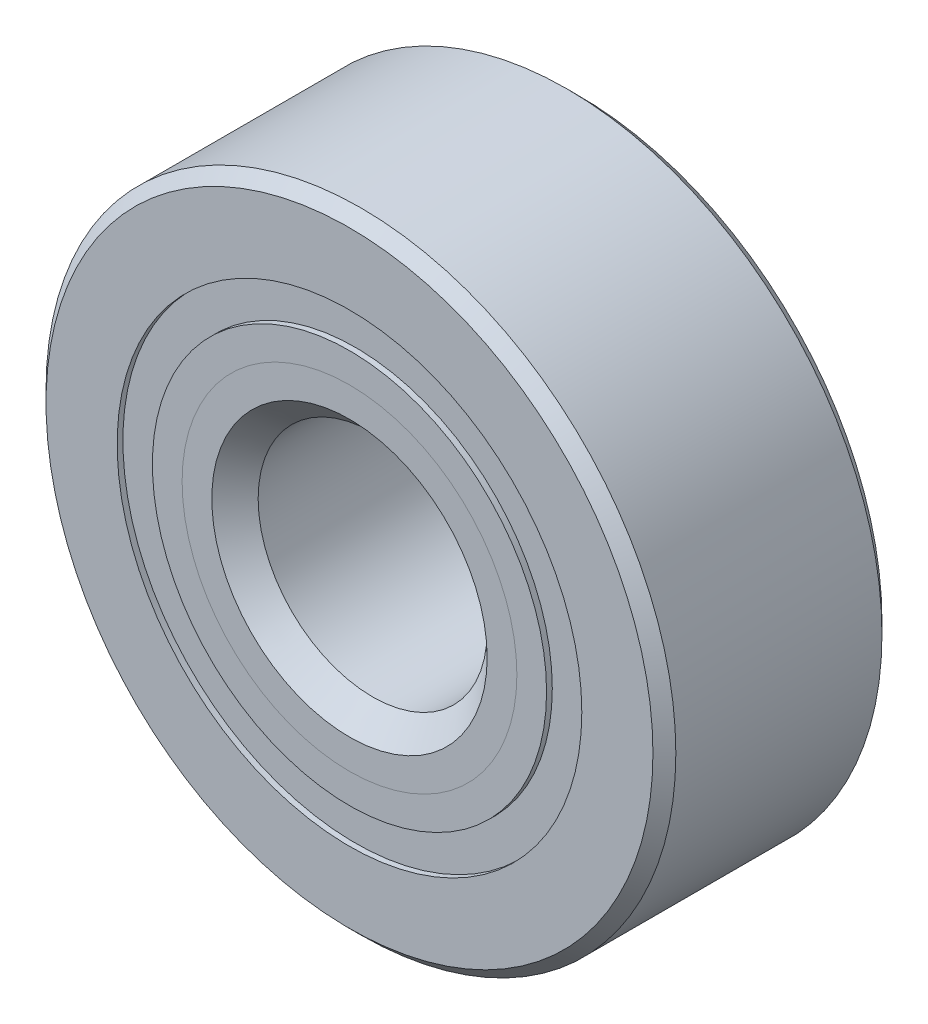
ISO-10303-21;
HEADER;
FILE_DESCRIPTION(('STEP AP214'),'2;1');
FILE_NAME('part.step','',(''),(''),'','','');
FILE_SCHEMA(('AUTOMOTIVE_DESIGN { 1 0 10303 214 1 1 1 1 }'));
ENDSEC;
DATA;
#1=APPLICATION_CONTEXT('core data for automotive mechanical design processes');
#2=APPLICATION_PROTOCOL_DEFINITION('international standard','automotive_design',2000,#1);
#3=PRODUCT_CONTEXT('',#1,'mechanical');
#4=PRODUCT('Part','Part','',(#3));
#5=PRODUCT_RELATED_PRODUCT_CATEGORY('part','',(#4));
#6=PRODUCT_DEFINITION_FORMATION('','',#4);
#7=PRODUCT_DEFINITION_CONTEXT('part definition',#1,'design');
#8=PRODUCT_DEFINITION('design','',#6,#7);
#9=PRODUCT_DEFINITION_SHAPE('','',#8);
#10=(LENGTH_UNIT() NAMED_UNIT(*) SI_UNIT(.MILLI.,.METRE.));
#11=(NAMED_UNIT(*) PLANE_ANGLE_UNIT() SI_UNIT($,.RADIAN.));
#12=(NAMED_UNIT(*) SI_UNIT($,.STERADIAN.) SOLID_ANGLE_UNIT());
#13=UNCERTAINTY_MEASURE_WITH_UNIT(LENGTH_MEASURE(1.E-05),#10,'distance_accuracy_value','');
#14=(GEOMETRIC_REPRESENTATION_CONTEXT(3) GLOBAL_UNCERTAINTY_ASSIGNED_CONTEXT((#13)) GLOBAL_UNIT_ASSIGNED_CONTEXT((#10,
#11,#12)) REPRESENTATION_CONTEXT('',''));
#15=CARTESIAN_POINT('',(0.,0.,0.));
#16=DIRECTION('',(0.,0.,1.));
#17=DIRECTION('',(1.,0.,0.));
#18=AXIS2_PLACEMENT_3D('',#15,#16,#17);
#19=CARTESIAN_POINT('',(0.,6.44158653846153,-3.01625));
#20=DIRECTION('',(0.,0.,1.));
#21=DIRECTION('',(1.,0.,0.));
#22=AXIS2_PLACEMENT_3D('',#19,#20,#21);
#23=PLANE('',#22);
#24=CARTESIAN_POINT('',(0.,0.,-3.01625));
#25=DIRECTION('',(0.,0.,1.));
#26=DIRECTION('',(1.,0.,0.));
#27=AXIS2_PLACEMENT_3D('',#24,#25,#26);
#28=CIRCLE('',#27,6.44158653846153);
#29=CARTESIAN_POINT('',(6.44158653846153,0.,-3.01625));
#30=VERTEX_POINT('',#29);
#31=EDGE_CURVE('E64',#30,#30,#28,.T.);
#32=ORIENTED_EDGE('',*,*,#31,.F.);
#33=EDGE_LOOP('',(#32));
#34=FACE_BOUND('',#33,.T.);
#35=CARTESIAN_POINT('',(0.,0.,-3.01625));
#36=DIRECTION('',(0.,0.,1.));
#37=DIRECTION('',(1.,0.,0.));
#38=AXIS2_PLACEMENT_3D('',#35,#36,#37);
#39=CIRCLE('',#38,5.46466346153847);
#40=CARTESIAN_POINT('',(5.46466346153847,0.,-3.01625));
#41=VERTEX_POINT('',#40);
#42=EDGE_CURVE('E11',#41,#41,#39,.T.);
#43=ORIENTED_EDGE('',*,*,#42,.T.);
#44=EDGE_LOOP('',(#43));
#45=FACE_BOUND('',#44,.T.);
#46=ADVANCED_FACE('F50',(#34,#45),#23,.F.);
#47=CARTESIAN_POINT('',(0.,0.,3.175));
#48=DIRECTION('',(0.,0.,1.));
#49=DIRECTION('',(1.,0.,0.));
#50=AXIS2_PLACEMENT_3D('',#47,#48,#49);
#51=CYLINDRICAL_SURFACE('',#50,5.46466346153847);
#52=ORIENTED_EDGE('',*,*,#42,.F.);
#53=EDGE_LOOP('',(#52));
#54=FACE_BOUND('',#53,.T.);
#55=CARTESIAN_POINT('',(0.,0.,-1.4932612773582));
#56=DIRECTION('',(0.,0.,1.));
#57=DIRECTION('',(1.,0.,0.));
#58=AXIS2_PLACEMENT_3D('',#55,#56,#57);
#59=CIRCLE('',#58,5.46466346153847);
#60=CARTESIAN_POINT('',(5.46466346153847,0.,-1.4932612773582));
#61=VERTEX_POINT('',#60);
#62=EDGE_CURVE('E56',#61,#61,#59,.T.);
#63=ORIENTED_EDGE('',*,*,#62,.T.);
#64=EDGE_LOOP('',(#63));
#65=FACE_BOUND('',#64,.T.);
#66=ADVANCED_FACE('F73',(#54,#65),#51,.F.);
#67=CARTESIAN_POINT('',(0.,6.44158653846153,-1.4932612773582));
#68=DIRECTION('',(0.,0.,-1.));
#69=DIRECTION('',(-1.,0.,0.));
#70=AXIS2_PLACEMENT_3D('',#67,#68,#69);
#71=PLANE('',#70);
#72=ORIENTED_EDGE('',*,*,#62,.F.);
#73=EDGE_LOOP('',(#72));
#74=FACE_BOUND('',#73,.T.);
#75=CARTESIAN_POINT('',(0.,0.,-1.4932612773582));
#76=DIRECTION('',(0.,0.,1.));
#77=DIRECTION('',(1.,0.,0.));
#78=AXIS2_PLACEMENT_3D('',#75,#76,#77);
#79=CIRCLE('',#78,6.44158653846153);
#80=CARTESIAN_POINT('',(6.44158653846153,0.,-1.4932612773582));
#81=VERTEX_POINT('',#80);
#82=EDGE_CURVE('E60',#81,#81,#79,.T.);
#83=ORIENTED_EDGE('',*,*,#82,.T.);
#84=EDGE_LOOP('',(#83));
#85=FACE_BOUND('',#84,.T.);
#86=ADVANCED_FACE('F77',(#74,#85),#71,.F.);
#87=CARTESIAN_POINT('',(0.,0.,3.175));
#88=DIRECTION('',(0.,0.,1.));
#89=DIRECTION('',(1.,0.,0.));
#90=AXIS2_PLACEMENT_3D('',#87,#88,#89);
#91=CYLINDRICAL_SURFACE('',#90,6.44158653846153);
#92=ORIENTED_EDGE('',*,*,#82,.F.);
#93=EDGE_LOOP('',(#92));
#94=FACE_BOUND('',#93,.T.);
#95=ORIENTED_EDGE('',*,*,#31,.T.);
#96=EDGE_LOOP('',(#95));
#97=FACE_BOUND('',#96,.T.);
#98=ADVANCED_FACE('F70',(#94,#97),#91,.T.);
#99=CLOSED_SHELL('',(#46,#66,#86,#98));
#100=MANIFOLD_SOLID_BREP('B2',#99);
#101=CARTESIAN_POINT('',(0.,6.44158653846153,3.01625));
#102=DIRECTION('',(0.,0.,-1.));
#103=DIRECTION('',(-1.,0.,0.));
#104=AXIS2_PLACEMENT_3D('',#101,#102,#103);
#105=PLANE('',#104);
#106=CARTESIAN_POINT('',(0.,0.,3.01625));
#107=DIRECTION('',(0.,0.,1.));
#108=DIRECTION('',(1.,0.,0.));
#109=AXIS2_PLACEMENT_3D('',#106,#107,#108);
#110=CIRCLE('',#109,5.46466346153847);
#111=CARTESIAN_POINT('',(5.46466346153847,0.,3.01625));
#112=VERTEX_POINT('',#111);
#113=EDGE_CURVE('E49',#112,#112,#110,.T.);
#114=ORIENTED_EDGE('',*,*,#113,.F.);
#115=EDGE_LOOP('',(#114));
#116=FACE_BOUND('',#115,.T.);
#117=CARTESIAN_POINT('',(0.,0.,3.01625));
#118=DIRECTION('',(0.,0.,1.));
#119=DIRECTION('',(1.,0.,0.));
#120=AXIS2_PLACEMENT_3D('',#117,#118,#119);
#121=CIRCLE('',#120,6.44158653846153);
#122=CARTESIAN_POINT('',(6.44158653846153,0.,3.01625));
#123=VERTEX_POINT('',#122);
#124=EDGE_CURVE('E124',#123,#123,#121,.T.);
#125=ORIENTED_EDGE('',*,*,#124,.T.);
#126=EDGE_LOOP('',(#125));
#127=FACE_BOUND('',#126,.T.);
#128=ADVANCED_FACE('F110',(#116,#127),#105,.F.);
#129=CARTESIAN_POINT('',(0.,0.,3.175));
#130=DIRECTION('',(0.,0.,1.));
#131=DIRECTION('',(1.,0.,0.));
#132=AXIS2_PLACEMENT_3D('',#129,#130,#131);
#133=CYLINDRICAL_SURFACE('',#132,5.46466346153847);
#134=CARTESIAN_POINT('',(0.,0.,1.4932612773582));
#135=DIRECTION('',(0.,0.,1.));
#136=DIRECTION('',(1.,0.,0.));
#137=AXIS2_PLACEMENT_3D('',#134,#135,#136);
#138=CIRCLE('',#137,5.46466346153847);
#139=CARTESIAN_POINT('',(5.46466346153847,0.,1.4932612773582));
#140=VERTEX_POINT('',#139);
#141=EDGE_CURVE('E116',#140,#140,#138,.T.);
#142=ORIENTED_EDGE('',*,*,#141,.F.);
#143=EDGE_LOOP('',(#142));
#144=FACE_BOUND('',#143,.T.);
#145=ORIENTED_EDGE('',*,*,#113,.T.);
#146=EDGE_LOOP('',(#145));
#147=FACE_BOUND('',#146,.T.);
#148=ADVANCED_FACE('F139',(#144,#147),#133,.F.);
#149=CARTESIAN_POINT('',(0.,6.44158653846153,1.4932612773582));
#150=DIRECTION('',(0.,0.,1.));
#151=DIRECTION('',(1.,0.,0.));
#152=AXIS2_PLACEMENT_3D('',#149,#150,#151);
#153=PLANE('',#152);
#154=CARTESIAN_POINT('',(0.,0.,1.4932612773582));
#155=DIRECTION('',(0.,0.,1.));
#156=DIRECTION('',(1.,0.,0.));
#157=AXIS2_PLACEMENT_3D('',#154,#155,#156);
#158=CIRCLE('',#157,6.44158653846153);
#159=CARTESIAN_POINT('',(6.44158653846153,0.,1.4932612773582));
#160=VERTEX_POINT('',#159);
#161=EDGE_CURVE('E120',#160,#160,#158,.T.);
#162=ORIENTED_EDGE('',*,*,#161,.F.);
#163=EDGE_LOOP('',(#162));
#164=FACE_BOUND('',#163,.T.);
#165=ORIENTED_EDGE('',*,*,#141,.T.);
#166=EDGE_LOOP('',(#165));
#167=FACE_BOUND('',#166,.T.);
#168=ADVANCED_FACE('F134',(#164,#167),#153,.F.);
#169=CARTESIAN_POINT('',(0.,0.,3.175));
#170=DIRECTION('',(0.,0.,1.));
#171=DIRECTION('',(1.,0.,0.));
#172=AXIS2_PLACEMENT_3D('',#169,#170,#171);
#173=CYLINDRICAL_SURFACE('',#172,6.44158653846153);
#174=ORIENTED_EDGE('',*,*,#124,.F.);
#175=EDGE_LOOP('',(#174));
#176=FACE_BOUND('',#175,.T.);
#177=ORIENTED_EDGE('',*,*,#161,.T.);
#178=EDGE_LOOP('',(#177));
#179=FACE_BOUND('',#178,.T.);
#180=ADVANCED_FACE('F131',(#176,#179),#173,.T.);
#181=CLOSED_SHELL('',(#128,#148,#168,#180));
#182=MANIFOLD_SOLID_BREP('B6',#181);
#183=CARTESIAN_POINT('',(-4.20949505675111,4.20949505675122,0.));
#184=DIRECTION('',(0.,0.,1.));
#185=DIRECTION('',(-0.707106781186539,0.707106781186556,0.));
#186=AXIS2_PLACEMENT_3D('',#183,#184,#185);
#187=SPHERICAL_SURFACE('',#186,1.4932612773582);
#188=CARTESIAN_POINT('',(-4.20949505675111,4.20949505675122,1.4932612773582));
#189=VERTEX_POINT('',#188);
#190=VERTEX_LOOP('',#189);
#191=FACE_BOUND('',#190,.T.);
#192=ADVANCED_FACE('F170',(#191),#187,.T.);
#193=CLOSED_SHELL('',(#192));
#194=MANIFOLD_SOLID_BREP('B44',#193);
#195=CARTESIAN_POINT('',(-5.953125,0.,0.));
#196=DIRECTION('',(0.,0.,1.));
#197=DIRECTION('',(-1.,0.,0.));
#198=AXIS2_PLACEMENT_3D('',#195,#196,#197);
#199=SPHERICAL_SURFACE('',#198,1.4932612773582);
#200=CARTESIAN_POINT('',(-5.953125,0.,1.4932612773582));
#201=VERTEX_POINT('',#200);
#202=VERTEX_LOOP('',#201);
#203=FACE_BOUND('',#202,.T.);
#204=ADVANCED_FACE('F209',(#203),#199,.T.);
#205=CLOSED_SHELL('',(#204));
#206=MANIFOLD_SOLID_BREP('B106',#205);
#207=CARTESIAN_POINT('',(-4.2094950567512,-4.20949505675113,0.));
#208=DIRECTION('',(0.,0.,1.));
#209=DIRECTION('',(-0.707106781186554,-0.707106781186541,0.));
#210=AXIS2_PLACEMENT_3D('',#207,#208,#209);
#211=SPHERICAL_SURFACE('',#210,1.4932612773582);
#212=CARTESIAN_POINT('',(-4.2094950567512,-4.20949505675113,1.4932612773582));
#213=VERTEX_POINT('',#212);
#214=VERTEX_LOOP('',#213);
#215=FACE_BOUND('',#214,.T.);
#216=ADVANCED_FACE('F248',(#215),#211,.T.);
#217=CLOSED_SHELL('',(#216));
#218=MANIFOLD_SOLID_BREP('B166',#217);
#219=CARTESIAN_POINT('',(0.,-5.953125,0.));
#220=DIRECTION('',(0.,0.,1.));
#221=DIRECTION('',(0.,-1.,0.));
#222=AXIS2_PLACEMENT_3D('',#219,#220,#221);
#223=SPHERICAL_SURFACE('',#222,1.4932612773582);
#224=CARTESIAN_POINT('',(0.,-5.953125,1.4932612773582));
#225=VERTEX_POINT('',#224);
#226=VERTEX_LOOP('',#225);
#227=FACE_BOUND('',#226,.T.);
#228=ADVANCED_FACE('F287',(#227),#223,.T.);
#229=CLOSED_SHELL('',(#228));
#230=MANIFOLD_SOLID_BREP('B205',#229);
#231=CARTESIAN_POINT('',(4.20949505675114,-4.20949505675119,0.));
#232=DIRECTION('',(0.,0.,1.));
#233=DIRECTION('',(0.707106781186544,-0.707106781186551,0.));
#234=AXIS2_PLACEMENT_3D('',#231,#232,#233);
#235=SPHERICAL_SURFACE('',#234,1.4932612773582);
#236=CARTESIAN_POINT('',(4.20949505675114,-4.20949505675119,1.4932612773582));
#237=VERTEX_POINT('',#236);
#238=VERTEX_LOOP('',#237);
#239=FACE_BOUND('',#238,.T.);
#240=ADVANCED_FACE('F326',(#239),#235,.T.);
#241=CLOSED_SHELL('',(#240));
#242=MANIFOLD_SOLID_BREP('B244',#241);
#243=CARTESIAN_POINT('',(5.953125,0.,0.));
#244=DIRECTION('',(0.,0.,1.));
#245=DIRECTION('',(1.,0.,0.));
#246=AXIS2_PLACEMENT_3D('',#243,#244,#245);
#247=SPHERICAL_SURFACE('',#246,1.4932612773582);
#248=CARTESIAN_POINT('',(5.953125,0.,1.4932612773582));
#249=VERTEX_POINT('',#248);
#250=VERTEX_LOOP('',#249);
#251=FACE_BOUND('',#250,.T.);
#252=ADVANCED_FACE('F365',(#251),#247,.T.);
#253=CLOSED_SHELL('',(#252));
#254=MANIFOLD_SOLID_BREP('B283',#253);
#255=CARTESIAN_POINT('',(4.20949505675117,4.20949505675116,0.));
#256=DIRECTION('',(0.,0.,1.));
#257=DIRECTION('',(0.707106781186549,0.707106781186546,0.));
#258=AXIS2_PLACEMENT_3D('',#255,#256,#257);
#259=SPHERICAL_SURFACE('',#258,1.4932612773582);
#260=CARTESIAN_POINT('',(4.20949505675117,4.20949505675116,1.4932612773582));
#261=VERTEX_POINT('',#260);
#262=VERTEX_LOOP('',#261);
#263=FACE_BOUND('',#262,.T.);
#264=ADVANCED_FACE('F404',(#263),#259,.T.);
#265=CLOSED_SHELL('',(#264));
#266=MANIFOLD_SOLID_BREP('B322',#265);
#267=CARTESIAN_POINT('',(0.,5.953125,0.));
#268=DIRECTION('',(0.,0.,1.));
#269=DIRECTION('',(0.,1.,0.));
#270=AXIS2_PLACEMENT_3D('',#267,#268,#269);
#271=SPHERICAL_SURFACE('',#270,1.4932612773582);
#272=CARTESIAN_POINT('',(0.,5.953125,1.4932612773582));
#273=VERTEX_POINT('',#272);
#274=VERTEX_LOOP('',#273);
#275=FACE_BOUND('',#274,.T.);
#276=ADVANCED_FACE('F445',(#275),#271,.T.);
#277=CLOSED_SHELL('',(#276));
#278=MANIFOLD_SOLID_BREP('B361',#277);
#279=CARTESIAN_POINT('',(0.,4.64104766142968,3.175));
#280=DIRECTION('',(0.,0.,-1.));
#281=DIRECTION('',(-1.,0.,0.));
#282=AXIS2_PLACEMENT_3D('',#279,#280,#281);
#283=PLANE('',#282);
#284=CARTESIAN_POINT('',(0.,0.,3.175));
#285=DIRECTION('',(0.,0.,1.));
#286=DIRECTION('',(1.,0.,0.));
#287=AXIS2_PLACEMENT_3D('',#284,#285,#286);
#288=CIRCLE('',#287,3.8174318613209);
#289=CARTESIAN_POINT('',(3.8174318613209,0.,3.175));
#290=VERTEX_POINT('',#289);
#291=EDGE_CURVE('E498',#290,#290,#288,.T.);
#292=ORIENTED_EDGE('',*,*,#291,.F.);
#293=EDGE_LOOP('',(#292));
#294=FACE_BOUND('',#293,.T.);
#295=CARTESIAN_POINT('',(0.,0.,3.175));
#296=DIRECTION('',(0.,0.,1.));
#297=DIRECTION('',(1.,0.,0.));
#298=AXIS2_PLACEMENT_3D('',#295,#296,#297);
#299=CIRCLE('',#298,4.64104766142968);
#300=CARTESIAN_POINT('',(4.64104766142968,0.,3.175));
#301=VERTEX_POINT('',#300);
#302=EDGE_CURVE('E444',#301,#301,#299,.T.);
#303=ORIENTED_EDGE('',*,*,#302,.T.);
#304=EDGE_LOOP('',(#303));
#305=FACE_BOUND('',#304,.T.);
#306=ADVANCED_FACE('F464',(#294,#305),#283,.F.);
#307=CARTESIAN_POINT('',(0.,0.,2.35138419989122));
#308=DIRECTION('',(0.,0.,1.));
#309=DIRECTION('',(1.,0.,0.));
#310=AXIS2_PLACEMENT_3D('',#307,#308,#309);
#311=CONICAL_SURFACE('',#310,3.8174318613209,0.785398163397449);
#312=ORIENTED_EDGE('',*,*,#302,.F.);
#313=EDGE_LOOP('',(#312));
#314=FACE_BOUND('',#313,.T.);
#315=CARTESIAN_POINT('',(0.,0.,2.35138419989122));
#316=DIRECTION('',(0.,0.,1.));
#317=DIRECTION('',(1.,0.,0.));
#318=AXIS2_PLACEMENT_3D('',#315,#316,#317);
#319=CIRCLE('',#318,3.8174318613209);
#320=CARTESIAN_POINT('',(3.8174318613209,0.,2.35138419989122));
#321=VERTEX_POINT('',#320);
#322=EDGE_CURVE('E470',#321,#321,#319,.T.);
#323=ORIENTED_EDGE('',*,*,#322,.T.);
#324=EDGE_LOOP('',(#323));
#325=FACE_BOUND('',#324,.T.);
#326=ADVANCED_FACE('F505',(#314,#325),#311,.T.);
#327=CARTESIAN_POINT('',(0.,0.,3.175));
#328=DIRECTION('',(0.,0.,1.));
#329=DIRECTION('',(1.,0.,0.));
#330=AXIS2_PLACEMENT_3D('',#327,#328,#329);
#331=CYLINDRICAL_SURFACE('',#330,3.8174318613209);
#332=ORIENTED_EDGE('',*,*,#322,.F.);
#333=EDGE_LOOP('',(#332));
#334=FACE_BOUND('',#333,.T.);
#335=CARTESIAN_POINT('',(0.,0.,0.));
#336=DIRECTION('',(0.,0.,1.));
#337=DIRECTION('',(1.,0.,0.));
#338=AXIS2_PLACEMENT_3D('',#335,#336,#337);
#339=CIRCLE('',#338,3.8174318613209);
#340=CARTESIAN_POINT('',(3.8174318613209,0.,0.));
#341=VERTEX_POINT('',#340);
#342=EDGE_CURVE('E474',#341,#341,#339,.T.);
#343=ORIENTED_EDGE('',*,*,#342,.T.);
#344=EDGE_LOOP('',(#343));
#345=FACE_BOUND('',#344,.T.);
#346=ADVANCED_FACE('F509',(#334,#345),#331,.T.);
#347=CARTESIAN_POINT('',(0.,3.8174318613209,0.));
#348=DIRECTION('',(0.,0.,-1.));
#349=DIRECTION('',(-1.,0.,0.));
#350=AXIS2_PLACEMENT_3D('',#347,#348,#349);
#351=PLANE('',#350);
#352=ORIENTED_EDGE('',*,*,#342,.F.);
#353=EDGE_LOOP('',(#352));
#354=FACE_BOUND('',#353,.T.);
#355=CARTESIAN_POINT('',(0.,0.,0.));
#356=DIRECTION('',(0.,0.,1.));
#357=DIRECTION('',(1.,0.,0.));
#358=AXIS2_PLACEMENT_3D('',#355,#356,#357);
#359=CIRCLE('',#358,4.4598637226418);
#360=CARTESIAN_POINT('',(4.4598637226418,0.,0.));
#361=VERTEX_POINT('',#360);
#362=EDGE_CURVE('E478',#361,#361,#359,.T.);
#363=ORIENTED_EDGE('',*,*,#362,.T.);
#364=EDGE_LOOP('',(#363));
#365=FACE_BOUND('',#364,.T.);
#366=ADVANCED_FACE('F514',(#354,#365),#351,.F.);
#367=CARTESIAN_POINT('',(0.,0.,0.));
#368=DIRECTION('',(0.,0.,1.));
#369=DIRECTION('',(1.,0.,0.));
#370=AXIS2_PLACEMENT_3D('',#367,#368,#369);
#371=TOROIDAL_SURFACE('',#370,5.953125,1.4932612773582);
#372=ORIENTED_EDGE('',*,*,#362,.F.);
#373=EDGE_LOOP('',(#372));
#374=FACE_BOUND('',#373,.T.);
#375=CARTESIAN_POINT('',(0.,0.,-1.41111111111111));
#376=DIRECTION('',(0.,0.,1.));
#377=DIRECTION('',(1.,0.,0.));
#378=AXIS2_PLACEMENT_3D('',#375,#376,#377);
#379=CIRCLE('',#378,5.46466346153847);
#380=CARTESIAN_POINT('',(5.46466346153847,0.,-1.41111111111111));
#381=VERTEX_POINT('',#380);
#382=EDGE_CURVE('E483',#381,#381,#379,.T.);
#383=ORIENTED_EDGE('',*,*,#382,.T.);
#384=EDGE_LOOP('',(#383));
#385=FACE_BOUND('',#384,.T.);
#386=ADVANCED_FACE('F520',(#374,#385),#371,.F.);
#387=CARTESIAN_POINT('',(0.,0.,3.175));
#388=DIRECTION('',(0.,0.,1.));
#389=DIRECTION('',(1.,0.,0.));
#390=AXIS2_PLACEMENT_3D('',#387,#388,#389);
#391=CYLINDRICAL_SURFACE('',#390,5.46466346153846);
#392=ORIENTED_EDGE('',*,*,#382,.F.);
#393=EDGE_LOOP('',(#392));
#394=FACE_BOUND('',#393,.T.);
#395=CARTESIAN_POINT('',(0.,0.,-3.175));
#396=DIRECTION('',(0.,0.,1.));
#397=DIRECTION('',(1.,0.,0.));
#398=AXIS2_PLACEMENT_3D('',#395,#396,#397);
#399=CIRCLE('',#398,5.46466346153846);
#400=CARTESIAN_POINT('',(5.46466346153846,0.,-3.175));
#401=VERTEX_POINT('',#400);
#402=EDGE_CURVE('E486',#401,#401,#399,.T.);
#403=ORIENTED_EDGE('',*,*,#402,.T.);
#404=EDGE_LOOP('',(#403));
#405=FACE_BOUND('',#404,.T.);
#406=ADVANCED_FACE('F524',(#394,#405),#391,.T.);
#407=CARTESIAN_POINT('',(0.,3.4925,-3.175));
#408=DIRECTION('',(0.,0.,1.));
#409=DIRECTION('',(1.,0.,0.));
#410=AXIS2_PLACEMENT_3D('',#407,#408,#409);
#411=PLANE('',#410);
#412=ORIENTED_EDGE('',*,*,#402,.F.);
#413=EDGE_LOOP('',(#412));
#414=FACE_BOUND('',#413,.T.);
#415=CARTESIAN_POINT('',(0.,0.,-3.17500000000001));
#416=DIRECTION('',(0.,0.,1.));
#417=DIRECTION('',(1.,0.,0.));
#418=AXIS2_PLACEMENT_3D('',#415,#416,#417);
#419=CIRCLE('',#418,3.4925);
#420=CARTESIAN_POINT('',(3.4925,0.,-3.17500000000001));
#421=VERTEX_POINT('',#420);
#422=EDGE_CURVE('E489',#421,#421,#419,.T.);
#423=ORIENTED_EDGE('',*,*,#422,.T.);
#424=EDGE_LOOP('',(#423));
#425=FACE_BOUND('',#424,.T.);
#426=ADVANCED_FACE('F528',(#414,#425),#411,.F.);
#427=CARTESIAN_POINT('',(0.,0.,-2.8575));
#428=DIRECTION('',(0.,0.,-1.));
#429=DIRECTION('',(-1.,0.,0.));
#430=AXIS2_PLACEMENT_3D('',#427,#428,#429);
#431=CONICAL_SURFACE('',#430,3.175,0.785398163397448);
#432=ORIENTED_EDGE('',*,*,#422,.F.);
#433=EDGE_LOOP('',(#432));
#434=FACE_BOUND('',#433,.T.);
#435=CARTESIAN_POINT('',(0.,0.,-2.8575));
#436=DIRECTION('',(0.,0.,1.));
#437=DIRECTION('',(1.,0.,0.));
#438=AXIS2_PLACEMENT_3D('',#435,#436,#437);
#439=CIRCLE('',#438,3.175);
#440=CARTESIAN_POINT('',(3.175,0.,-2.8575));
#441=VERTEX_POINT('',#440);
#442=EDGE_CURVE('E492',#441,#441,#439,.T.);
#443=ORIENTED_EDGE('',*,*,#442,.T.);
#444=EDGE_LOOP('',(#443));
#445=FACE_BOUND('',#444,.T.);
#446=ADVANCED_FACE('F532',(#434,#445),#431,.F.);
#447=CARTESIAN_POINT('',(0.,0.,3.175));
#448=DIRECTION('',(0.,0.,1.));
#449=DIRECTION('',(1.,0.,0.));
#450=AXIS2_PLACEMENT_3D('',#447,#448,#449);
#451=CYLINDRICAL_SURFACE('',#450,3.175);
#452=ORIENTED_EDGE('',*,*,#442,.F.);
#453=EDGE_LOOP('',(#452));
#454=FACE_BOUND('',#453,.T.);
#455=CARTESIAN_POINT('',(0.,0.,2.5325681386791));
#456=DIRECTION('',(0.,0.,1.));
#457=DIRECTION('',(1.,0.,0.));
#458=AXIS2_PLACEMENT_3D('',#455,#456,#457);
#459=CIRCLE('',#458,3.175);
#460=CARTESIAN_POINT('',(3.175,0.,2.5325681386791));
#461=VERTEX_POINT('',#460);
#462=EDGE_CURVE('E495',#461,#461,#459,.T.);
#463=ORIENTED_EDGE('',*,*,#462,.T.);
#464=EDGE_LOOP('',(#463));
#465=FACE_BOUND('',#464,.T.);
#466=ADVANCED_FACE('F536',(#454,#465),#451,.F.);
#467=CARTESIAN_POINT('',(0.,0.,3.175));
#468=DIRECTION('',(0.,0.,1.));
#469=DIRECTION('',(1.,0.,0.));
#470=AXIS2_PLACEMENT_3D('',#467,#468,#469);
#471=CONICAL_SURFACE('',#470,3.8174318613209,0.78539816339745);
#472=ORIENTED_EDGE('',*,*,#462,.F.);
#473=EDGE_LOOP('',(#472));
#474=FACE_BOUND('',#473,.T.);
#475=ORIENTED_EDGE('',*,*,#291,.T.);
#476=EDGE_LOOP('',(#475));
#477=FACE_BOUND('',#476,.T.);
#478=ADVANCED_FACE('F502',(#474,#477),#471,.F.);
#479=CLOSED_SHELL('',(#306,#326,#346,#366,#386,#406,#426,#446,#466,#478));
#480=MANIFOLD_SOLID_BREP('B400',#479);
#481=CARTESIAN_POINT('',(0.,5.46466346153847,3.175));
#482=DIRECTION('',(0.,0.,-1.));
#483=DIRECTION('',(-1.,0.,0.));
#484=AXIS2_PLACEMENT_3D('',#481,#482,#483);
#485=PLANE('',#484);
#486=CARTESIAN_POINT('',(0.,0.,3.175));
#487=DIRECTION('',(0.,0.,1.));
#488=DIRECTION('',(1.,0.,0.));
#489=AXIS2_PLACEMENT_3D('',#486,#487,#488);
#490=CIRCLE('',#489,4.64104766142968);
#491=CARTESIAN_POINT('',(4.64104766142968,0.,3.175));
#492=VERTEX_POINT('',#491);
#493=EDGE_CURVE('E463',#492,#492,#490,.T.);
#494=ORIENTED_EDGE('',*,*,#493,.F.);
#495=EDGE_LOOP('',(#494));
#496=FACE_BOUND('',#495,.T.);
#497=CARTESIAN_POINT('',(0.,0.,3.175));
#498=DIRECTION('',(0.,0.,1.));
#499=DIRECTION('',(1.,0.,0.));
#500=AXIS2_PLACEMENT_3D('',#497,#498,#499);
#501=CIRCLE('',#500,5.46466346153847);
#502=CARTESIAN_POINT('',(5.46466346153847,0.,3.175));
#503=VERTEX_POINT('',#502);
#504=EDGE_CURVE('E625',#503,#503,#501,.T.);
#505=ORIENTED_EDGE('',*,*,#504,.T.);
#506=EDGE_LOOP('',(#505));
#507=FACE_BOUND('',#506,.T.);
#508=ADVANCED_FACE('F603',(#496,#507),#485,.F.);
#509=CARTESIAN_POINT('',(0.,0.,3.175));
#510=DIRECTION('',(0.,0.,1.));
#511=DIRECTION('',(1.,0.,0.));
#512=AXIS2_PLACEMENT_3D('',#509,#510,#511);
#513=CONICAL_SURFACE('',#512,4.64104766142968,0.785398163397449);
#514=CARTESIAN_POINT('',(0.,0.,2.35138419989122));
#515=DIRECTION('',(0.,0.,1.));
#516=DIRECTION('',(1.,0.,0.));
#517=AXIS2_PLACEMENT_3D('',#514,#515,#516);
#518=CIRCLE('',#517,3.8174318613209);
#519=CARTESIAN_POINT('',(3.8174318613209,0.,2.35138419989122));
#520=VERTEX_POINT('',#519);
#521=EDGE_CURVE('E609',#520,#520,#518,.T.);
#522=ORIENTED_EDGE('',*,*,#521,.F.);
#523=EDGE_LOOP('',(#522));
#524=FACE_BOUND('',#523,.T.);
#525=ORIENTED_EDGE('',*,*,#493,.T.);
#526=EDGE_LOOP('',(#525));
#527=FACE_BOUND('',#526,.T.);
#528=ADVANCED_FACE('F650',(#524,#527),#513,.F.);
#529=CARTESIAN_POINT('',(0.,0.,3.175));
#530=DIRECTION('',(0.,0.,1.));
#531=DIRECTION('',(1.,0.,0.));
#532=AXIS2_PLACEMENT_3D('',#529,#530,#531);
#533=CYLINDRICAL_SURFACE('',#532,3.8174318613209);
#534=CARTESIAN_POINT('',(0.,0.,0.));
#535=DIRECTION('',(0.,0.,1.));
#536=DIRECTION('',(1.,0.,0.));
#537=AXIS2_PLACEMENT_3D('',#534,#535,#536);
#538=CIRCLE('',#537,3.8174318613209);
#539=CARTESIAN_POINT('',(3.8174318613209,0.,0.));
#540=VERTEX_POINT('',#539);
#541=EDGE_CURVE('E613',#540,#540,#538,.T.);
#542=ORIENTED_EDGE('',*,*,#541,.F.);
#543=EDGE_LOOP('',(#542));
#544=FACE_BOUND('',#543,.T.);
#545=ORIENTED_EDGE('',*,*,#521,.T.);
#546=EDGE_LOOP('',(#545));
#547=FACE_BOUND('',#546,.T.);
#548=ADVANCED_FACE('F645',(#544,#547),#533,.F.);
#549=CARTESIAN_POINT('',(0.,3.8174318613209,0.));
#550=DIRECTION('',(0.,0.,1.));
#551=DIRECTION('',(1.,0.,0.));
#552=AXIS2_PLACEMENT_3D('',#549,#550,#551);
#553=PLANE('',#552);
#554=CARTESIAN_POINT('',(0.,0.,0.));
#555=DIRECTION('',(0.,0.,1.));
#556=DIRECTION('',(1.,0.,0.));
#557=AXIS2_PLACEMENT_3D('',#554,#555,#556);
#558=CIRCLE('',#557,4.4598637226418);
#559=CARTESIAN_POINT('',(4.4598637226418,0.,0.));
#560=VERTEX_POINT('',#559);
#561=EDGE_CURVE('E617',#560,#560,#558,.T.);
#562=ORIENTED_EDGE('',*,*,#561,.F.);
#563=EDGE_LOOP('',(#562));
#564=FACE_BOUND('',#563,.T.);
#565=ORIENTED_EDGE('',*,*,#541,.T.);
#566=EDGE_LOOP('',(#565));
#567=FACE_BOUND('',#566,.T.);
#568=ADVANCED_FACE('F639',(#564,#567),#553,.F.);
#569=CARTESIAN_POINT('',(0.,0.,0.));
#570=DIRECTION('',(0.,0.,1.));
#571=DIRECTION('',(1.,0.,0.));
#572=AXIS2_PLACEMENT_3D('',#569,#570,#571);
#573=TOROIDAL_SURFACE('',#572,5.953125,1.4932612773582);
#574=CARTESIAN_POINT('',(0.,0.,1.41111111111111));
#575=DIRECTION('',(0.,0.,1.));
#576=DIRECTION('',(1.,0.,0.));
#577=AXIS2_PLACEMENT_3D('',#574,#575,#576);
#578=CIRCLE('',#577,5.46466346153847);
#579=CARTESIAN_POINT('',(5.46466346153847,0.,1.41111111111111));
#580=VERTEX_POINT('',#579);
#581=EDGE_CURVE('E622',#580,#580,#578,.T.);
#582=ORIENTED_EDGE('',*,*,#581,.F.);
#583=EDGE_LOOP('',(#582));
#584=FACE_BOUND('',#583,.T.);
#585=ORIENTED_EDGE('',*,*,#561,.T.);
#586=EDGE_LOOP('',(#585));
#587=FACE_BOUND('',#586,.T.);
#588=ADVANCED_FACE('F633',(#584,#587),#573,.F.);
#589=CARTESIAN_POINT('',(0.,0.,3.175));
#590=DIRECTION('',(0.,0.,1.));
#591=DIRECTION('',(1.,0.,0.));
#592=AXIS2_PLACEMENT_3D('',#589,#590,#591);
#593=CYLINDRICAL_SURFACE('',#592,5.46466346153847);
#594=ORIENTED_EDGE('',*,*,#504,.F.);
#595=EDGE_LOOP('',(#594));
#596=FACE_BOUND('',#595,.T.);
#597=ORIENTED_EDGE('',*,*,#581,.T.);
#598=EDGE_LOOP('',(#597));
#599=FACE_BOUND('',#598,.T.);
#600=ADVANCED_FACE('F630',(#596,#599),#593,.T.);
#601=CLOSED_SHELL('',(#508,#528,#548,#568,#588,#600));
#602=MANIFOLD_SOLID_BREP('B439',#601);
#603=CARTESIAN_POINT('',(0.,0.,2.8575));
#604=DIRECTION('',(0.,0.,-1.));
#605=DIRECTION('',(-1.,0.,0.));
#606=AXIS2_PLACEMENT_3D('',#603,#604,#605);
#607=CONICAL_SURFACE('',#606,8.73125,0.785398163397448);
#608=CARTESIAN_POINT('',(0.,0.,3.175));
#609=DIRECTION('',(0.,0.,1.));
#610=DIRECTION('',(1.,0.,0.));
#611=AXIS2_PLACEMENT_3D('',#608,#609,#610);
#612=CIRCLE('',#611,8.41375);
#613=CARTESIAN_POINT('',(8.41375,0.,3.175));
#614=VERTEX_POINT('',#613);
#615=EDGE_CURVE('E711',#614,#614,#612,.T.);
#616=ORIENTED_EDGE('',*,*,#615,.F.);
#617=EDGE_LOOP('',(#616));
#618=FACE_BOUND('',#617,.T.);
#619=CARTESIAN_POINT('',(0.,0.,2.8575));
#620=DIRECTION('',(0.,0.,1.));
#621=DIRECTION('',(1.,0.,0.));
#622=AXIS2_PLACEMENT_3D('',#619,#620,#621);
#623=CIRCLE('',#622,8.73125);
#624=CARTESIAN_POINT('',(8.73125,0.,2.8575));
#625=VERTEX_POINT('',#624);
#626=EDGE_CURVE('E602',#625,#625,#623,.T.);
#627=ORIENTED_EDGE('',*,*,#626,.T.);
#628=EDGE_LOOP('',(#627));
#629=FACE_BOUND('',#628,.T.);
#630=ADVANCED_FACE('F683',(#618,#629),#607,.T.);
#631=CARTESIAN_POINT('',(0.,0.,3.175));
#632=DIRECTION('',(0.,0.,1.));
#633=DIRECTION('',(1.,0.,0.));
#634=AXIS2_PLACEMENT_3D('',#631,#632,#633);
#635=CYLINDRICAL_SURFACE('',#634,8.73125);
#636=ORIENTED_EDGE('',*,*,#626,.F.);
#637=EDGE_LOOP('',(#636));
#638=FACE_BOUND('',#637,.T.);
#639=CARTESIAN_POINT('',(0.,0.,-2.8575));
#640=DIRECTION('',(0.,0.,1.));
#641=DIRECTION('',(1.,0.,0.));
#642=AXIS2_PLACEMENT_3D('',#639,#640,#641);
#643=CIRCLE('',#642,8.73125);
#644=CARTESIAN_POINT('',(8.73125,0.,-2.8575));
#645=VERTEX_POINT('',#644);
#646=EDGE_CURVE('E689',#645,#645,#643,.T.);
#647=ORIENTED_EDGE('',*,*,#646,.T.);
#648=EDGE_LOOP('',(#647));
#649=FACE_BOUND('',#648,.T.);
#650=ADVANCED_FACE('F718',(#638,#649),#635,.T.);
#651=CARTESIAN_POINT('',(0.,0.,-3.175));
#652=DIRECTION('',(0.,0.,1.));
#653=DIRECTION('',(1.,0.,0.));
#654=AXIS2_PLACEMENT_3D('',#651,#652,#653);
#655=CONICAL_SURFACE('',#654,8.41375,0.785398163397448);
#656=ORIENTED_EDGE('',*,*,#646,.F.);
#657=EDGE_LOOP('',(#656));
#658=FACE_BOUND('',#657,.T.);
#659=CARTESIAN_POINT('',(0.,0.,-3.175));
#660=DIRECTION('',(0.,0.,1.));
#661=DIRECTION('',(1.,0.,0.));
#662=AXIS2_PLACEMENT_3D('',#659,#660,#661);
#663=CIRCLE('',#662,8.41375);
#664=CARTESIAN_POINT('',(8.41375,0.,-3.175));
#665=VERTEX_POINT('',#664);
#666=EDGE_CURVE('E693',#665,#665,#663,.T.);
#667=ORIENTED_EDGE('',*,*,#666,.T.);
#668=EDGE_LOOP('',(#667));
#669=FACE_BOUND('',#668,.T.);
#670=ADVANCED_FACE('F722',(#658,#669),#655,.T.);
#671=CARTESIAN_POINT('',(0.,8.41375,-3.175));
#672=DIRECTION('',(0.,0.,1.));
#673=DIRECTION('',(1.,0.,0.));
#674=AXIS2_PLACEMENT_3D('',#671,#672,#673);
#675=PLANE('',#674);
#676=ORIENTED_EDGE('',*,*,#666,.F.);
#677=EDGE_LOOP('',(#676));
#678=FACE_BOUND('',#677,.T.);
#679=CARTESIAN_POINT('',(0.,0.,-3.175));
#680=DIRECTION('',(0.,0.,1.));
#681=DIRECTION('',(1.,0.,0.));
#682=AXIS2_PLACEMENT_3D('',#679,#680,#681);
#683=CIRCLE('',#682,6.44158653846153);
#684=CARTESIAN_POINT('',(6.44158653846153,0.,-3.175));
#685=VERTEX_POINT('',#684);
#686=EDGE_CURVE('E697',#685,#685,#683,.T.);
#687=ORIENTED_EDGE('',*,*,#686,.T.);
#688=EDGE_LOOP('',(#687));
#689=FACE_BOUND('',#688,.T.);
#690=ADVANCED_FACE('F727',(#678,#689),#675,.F.);
#691=CARTESIAN_POINT('',(0.,0.,3.175));
#692=DIRECTION('',(0.,0.,1.));
#693=DIRECTION('',(1.,0.,0.));
#694=AXIS2_PLACEMENT_3D('',#691,#692,#693);
#695=CYLINDRICAL_SURFACE('',#694,6.44158653846153);
#696=ORIENTED_EDGE('',*,*,#686,.F.);
#697=EDGE_LOOP('',(#696));
#698=FACE_BOUND('',#697,.T.);
#699=CARTESIAN_POINT('',(0.,0.,-1.41111111111111));
#700=DIRECTION('',(0.,0.,1.));
#701=DIRECTION('',(1.,0.,0.));
#702=AXIS2_PLACEMENT_3D('',#699,#700,#701);
#703=CIRCLE('',#702,6.44158653846153);
#704=CARTESIAN_POINT('',(6.44158653846153,0.,-1.41111111111111));
#705=VERTEX_POINT('',#704);
#706=EDGE_CURVE('E702',#705,#705,#703,.T.);
#707=ORIENTED_EDGE('',*,*,#706,.T.);
#708=EDGE_LOOP('',(#707));
#709=FACE_BOUND('',#708,.T.);
#710=ADVANCED_FACE('F733',(#698,#709),#695,.F.);
#711=CARTESIAN_POINT('',(0.,0.,0.));
#712=DIRECTION('',(0.,0.,1.));
#713=DIRECTION('',(1.,0.,0.));
#714=AXIS2_PLACEMENT_3D('',#711,#712,#713);
#715=TOROIDAL_SURFACE('',#714,5.953125,1.4932612773582);
#716=ORIENTED_EDGE('',*,*,#706,.F.);
#717=EDGE_LOOP('',(#716));
#718=FACE_BOUND('',#717,.T.);
#719=CARTESIAN_POINT('',(0.,0.,1.41111111111111));
#720=DIRECTION('',(0.,0.,1.));
#721=DIRECTION('',(1.,0.,0.));
#722=AXIS2_PLACEMENT_3D('',#719,#720,#721);
#723=CIRCLE('',#722,6.44158653846153);
#724=CARTESIAN_POINT('',(6.44158653846153,0.,1.41111111111111));
#725=VERTEX_POINT('',#724);
#726=EDGE_CURVE('E705',#725,#725,#723,.T.);
#727=ORIENTED_EDGE('',*,*,#726,.T.);
#728=EDGE_LOOP('',(#727));
#729=FACE_BOUND('',#728,.T.);
#730=ADVANCED_FACE('F737',(#718,#729),#715,.F.);
#731=CARTESIAN_POINT('',(0.,0.,3.175));
#732=DIRECTION('',(0.,0.,1.));
#733=DIRECTION('',(1.,0.,0.));
#734=AXIS2_PLACEMENT_3D('',#731,#732,#733);
#735=CYLINDRICAL_SURFACE('',#734,6.44158653846153);
#736=ORIENTED_EDGE('',*,*,#726,.F.);
#737=EDGE_LOOP('',(#736));
#738=FACE_BOUND('',#737,.T.);
#739=CARTESIAN_POINT('',(0.,0.,3.175));
#740=DIRECTION('',(0.,0.,1.));
#741=DIRECTION('',(1.,0.,0.));
#742=AXIS2_PLACEMENT_3D('',#739,#740,#741);
#743=CIRCLE('',#742,6.44158653846153);
#744=CARTESIAN_POINT('',(6.44158653846153,0.,3.175));
#745=VERTEX_POINT('',#744);
#746=EDGE_CURVE('E708',#745,#745,#743,.T.);
#747=ORIENTED_EDGE('',*,*,#746,.T.);
#748=EDGE_LOOP('',(#747));
#749=FACE_BOUND('',#748,.T.);
#750=ADVANCED_FACE('F741',(#738,#749),#735,.F.);
#751=CARTESIAN_POINT('',(0.,8.41375,3.175));
#752=DIRECTION('',(0.,0.,-1.));
#753=DIRECTION('',(-1.,0.,0.));
#754=AXIS2_PLACEMENT_3D('',#751,#752,#753);
#755=PLANE('',#754);
#756=ORIENTED_EDGE('',*,*,#746,.F.);
#757=EDGE_LOOP('',(#756));
#758=FACE_BOUND('',#757,.T.);
#759=ORIENTED_EDGE('',*,*,#615,.T.);
#760=EDGE_LOOP('',(#759));
#761=FACE_BOUND('',#760,.T.);
#762=ADVANCED_FACE('F715',(#758,#761),#755,.F.);
#763=CLOSED_SHELL('',(#630,#650,#670,#690,#710,#730,#750,#762));
#764=MANIFOLD_SOLID_BREP('B458',#763);
#765=ADVANCED_BREP_SHAPE_REPRESENTATION('',(#18,#100,#182,#194,#206,#218,#230,#242,#254,#266,
#278,#480,#602,#764),#14);
#766=SHAPE_DEFINITION_REPRESENTATION(#9,#765);
ENDSEC;
END-ISO-10303-21;
